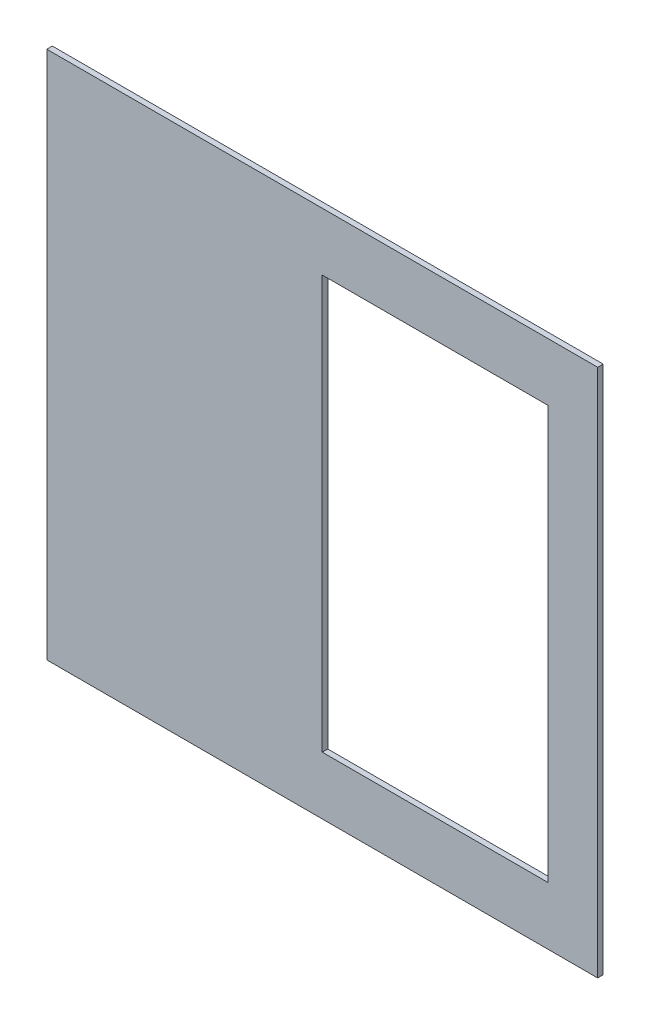
ISO-10303-21;
HEADER;
FILE_DESCRIPTION(('STEP AP214'),'2;1');
FILE_NAME('part.step','',(''),(''),'','','');
FILE_SCHEMA(('AUTOMOTIVE_DESIGN { 1 0 10303 214 1 1 1 1 }'));
ENDSEC;
DATA;
#1=APPLICATION_CONTEXT('core data for automotive mechanical design processes');
#2=APPLICATION_PROTOCOL_DEFINITION('international standard','automotive_design',2000,#1);
#3=PRODUCT_CONTEXT('',#1,'mechanical');
#4=PRODUCT('Part','Part','',(#3));
#5=PRODUCT_RELATED_PRODUCT_CATEGORY('part','',(#4));
#6=PRODUCT_DEFINITION_FORMATION('','',#4);
#7=PRODUCT_DEFINITION_CONTEXT('part definition',#1,'design');
#8=PRODUCT_DEFINITION('design','',#6,#7);
#9=PRODUCT_DEFINITION_SHAPE('','',#8);
#10=(LENGTH_UNIT() NAMED_UNIT(*) SI_UNIT(.MILLI.,.METRE.));
#11=(NAMED_UNIT(*) PLANE_ANGLE_UNIT() SI_UNIT($,.RADIAN.));
#12=(NAMED_UNIT(*) SI_UNIT($,.STERADIAN.) SOLID_ANGLE_UNIT());
#13=UNCERTAINTY_MEASURE_WITH_UNIT(LENGTH_MEASURE(1.E-05),#10,'distance_accuracy_value','');
#14=(GEOMETRIC_REPRESENTATION_CONTEXT(3) GLOBAL_UNCERTAINTY_ASSIGNED_CONTEXT((#13)) GLOBAL_UNIT_ASSIGNED_CONTEXT((#10,
#11,#12)) REPRESENTATION_CONTEXT('',''));
#15=CARTESIAN_POINT('',(0.,0.,0.));
#16=DIRECTION('',(0.,0.,1.));
#17=DIRECTION('',(1.,0.,0.));
#18=AXIS2_PLACEMENT_3D('',#15,#16,#17);
#19=CARTESIAN_POINT('',(-317.5,-304.8,3.175));
#20=DIRECTION('',(-1.,0.,0.));
#21=DIRECTION('',(0.,0.,1.));
#22=AXIS2_PLACEMENT_3D('',#19,#20,#21);
#23=PLANE('',#22);
#24=DIRECTION('',(0.,1.,0.));
#25=VECTOR('',#24,1.);
#26=CARTESIAN_POINT('',(-317.5,-304.8,-3.175));
#27=LINE('',#26,#25);
#28=CARTESIAN_POINT('',(-317.5,-304.8,-3.175));
#29=VERTEX_POINT('',#28);
#30=CARTESIAN_POINT('',(-317.5,304.8,-3.175));
#31=VERTEX_POINT('',#30);
#32=EDGE_CURVE('E148',#29,#31,#27,.T.);
#33=ORIENTED_EDGE('',*,*,#32,.F.);
#34=DIRECTION('',(0.,0.,-1.));
#35=VECTOR('',#34,1.);
#36=CARTESIAN_POINT('',(-317.5,-304.8,3.175));
#37=LINE('',#36,#35);
#38=CARTESIAN_POINT('',(-317.5,-304.8,3.175));
#39=VERTEX_POINT('',#38);
#40=EDGE_CURVE('E11',#39,#29,#37,.T.);
#41=ORIENTED_EDGE('',*,*,#40,.F.);
#42=DIRECTION('',(0.,1.,0.));
#43=VECTOR('',#42,1.);
#44=CARTESIAN_POINT('',(-317.5,-304.8,3.175));
#45=LINE('',#44,#43);
#46=CARTESIAN_POINT('',(-317.5,304.8,3.175));
#47=VERTEX_POINT('',#46);
#48=EDGE_CURVE('E154',#39,#47,#45,.T.);
#49=ORIENTED_EDGE('',*,*,#48,.T.);
#50=DIRECTION('',(0.,0.,-1.));
#51=VECTOR('',#50,1.);
#52=CARTESIAN_POINT('',(-317.5,304.8,3.175));
#53=LINE('',#52,#51);
#54=EDGE_CURVE('E42',#47,#31,#53,.T.);
#55=ORIENTED_EDGE('',*,*,#54,.T.);
#56=EDGE_LOOP('',(#33,#41,#49,#55));
#57=FACE_BOUND('',#56,.T.);
#58=ADVANCED_FACE('F39',(#57),#23,.T.);
#59=CARTESIAN_POINT('',(-317.5,-304.8,3.175));
#60=DIRECTION('',(0.,1.,0.));
#61=DIRECTION('',(0.,0.,1.));
#62=AXIS2_PLACEMENT_3D('',#59,#60,#61);
#63=PLANE('',#62);
#64=DIRECTION('',(1.,0.,0.));
#65=VECTOR('',#64,1.);
#66=CARTESIAN_POINT('',(-317.5,-304.8,-3.175));
#67=LINE('',#66,#65);
#68=CARTESIAN_POINT('',(317.5,-304.8,-3.175));
#69=VERTEX_POINT('',#68);
#70=EDGE_CURVE('E159',#29,#69,#67,.T.);
#71=ORIENTED_EDGE('',*,*,#70,.T.);
#72=DIRECTION('',(0.,0.,-1.));
#73=VECTOR('',#72,1.);
#74=CARTESIAN_POINT('',(317.5,-304.8,3.175));
#75=LINE('',#74,#73);
#76=CARTESIAN_POINT('',(317.5,-304.8,3.175));
#77=VERTEX_POINT('',#76);
#78=EDGE_CURVE('E48',#77,#69,#75,.T.);
#79=ORIENTED_EDGE('',*,*,#78,.F.);
#80=DIRECTION('',(1.,0.,0.));
#81=VECTOR('',#80,1.);
#82=CARTESIAN_POINT('',(-317.5,-304.8,3.175));
#83=LINE('',#82,#81);
#84=EDGE_CURVE('E166',#39,#77,#83,.T.);
#85=ORIENTED_EDGE('',*,*,#84,.F.);
#86=ORIENTED_EDGE('',*,*,#40,.T.);
#87=EDGE_LOOP('',(#71,#79,#85,#86));
#88=FACE_BOUND('',#87,.T.);
#89=ADVANCED_FACE('F199',(#88),#63,.F.);
#90=CARTESIAN_POINT('',(317.5,-304.8,3.175));
#91=DIRECTION('',(-1.,0.,0.));
#92=DIRECTION('',(0.,0.,1.));
#93=AXIS2_PLACEMENT_3D('',#90,#91,#92);
#94=PLANE('',#93);
#95=DIRECTION('',(0.,1.,0.));
#96=VECTOR('',#95,1.);
#97=CARTESIAN_POINT('',(317.5,-304.8,-3.175));
#98=LINE('',#97,#96);
#99=CARTESIAN_POINT('',(317.5,304.8,-3.175));
#100=VERTEX_POINT('',#99);
#101=EDGE_CURVE('E176',#69,#100,#98,.T.);
#102=ORIENTED_EDGE('',*,*,#101,.T.);
#103=DIRECTION('',(0.,0.,-1.));
#104=VECTOR('',#103,1.);
#105=CARTESIAN_POINT('',(317.5,304.8,3.175));
#106=LINE('',#105,#104);
#107=CARTESIAN_POINT('',(317.5,304.8,3.175));
#108=VERTEX_POINT('',#107);
#109=EDGE_CURVE('E184',#108,#100,#106,.T.);
#110=ORIENTED_EDGE('',*,*,#109,.F.);
#111=DIRECTION('',(0.,1.,0.));
#112=VECTOR('',#111,1.);
#113=CARTESIAN_POINT('',(317.5,-304.8,3.175));
#114=LINE('',#113,#112);
#115=EDGE_CURVE('E163',#77,#108,#114,.T.);
#116=ORIENTED_EDGE('',*,*,#115,.F.);
#117=ORIENTED_EDGE('',*,*,#78,.T.);
#118=EDGE_LOOP('',(#102,#110,#116,#117));
#119=FACE_BOUND('',#118,.T.);
#120=ADVANCED_FACE('F203',(#119),#94,.F.);
#121=CARTESIAN_POINT('',(-317.5,304.8,3.175));
#122=DIRECTION('',(0.,1.,0.));
#123=DIRECTION('',(0.,0.,1.));
#124=AXIS2_PLACEMENT_3D('',#121,#122,#123);
#125=PLANE('',#124);
#126=DIRECTION('',(1.,0.,0.));
#127=VECTOR('',#126,1.);
#128=CARTESIAN_POINT('',(-317.5,304.8,-3.175));
#129=LINE('',#128,#127);
#130=EDGE_CURVE('E172',#31,#100,#129,.T.);
#131=ORIENTED_EDGE('',*,*,#130,.F.);
#132=ORIENTED_EDGE('',*,*,#54,.F.);
#133=DIRECTION('',(1.,0.,0.));
#134=VECTOR('',#133,1.);
#135=CARTESIAN_POINT('',(-317.5,304.8,3.175));
#136=LINE('',#135,#134);
#137=EDGE_CURVE('E158',#47,#108,#136,.T.);
#138=ORIENTED_EDGE('',*,*,#137,.T.);
#139=ORIENTED_EDGE('',*,*,#109,.T.);
#140=EDGE_LOOP('',(#131,#132,#138,#139));
#141=FACE_BOUND('',#140,.T.);
#142=ADVANCED_FACE('F194',(#141),#125,.T.);
#143=CARTESIAN_POINT('',(0.,0.,3.175));
#144=DIRECTION('',(0.,0.,-1.));
#145=DIRECTION('',(-1.,0.,0.));
#146=AXIS2_PLACEMENT_3D('',#143,#144,#145);
#147=PLANE('',#146);
#148=DIRECTION('',(-1.,0.,0.));
#149=VECTOR('',#148,1.);
#150=CARTESIAN_POINT('',(0.,238.125,3.175));
#151=LINE('',#150,#149);
#152=CARTESIAN_POINT('',(260.35,238.125,3.175));
#153=VERTEX_POINT('',#152);
#154=CARTESIAN_POINT('',(0.,238.125,3.175));
#155=VERTEX_POINT('',#154);
#156=EDGE_CURVE('E139',#153,#155,#151,.T.);
#157=ORIENTED_EDGE('',*,*,#156,.F.);
#158=DIRECTION('',(0.,1.,0.));
#159=VECTOR('',#158,1.);
#160=CARTESIAN_POINT('',(260.35,-238.125,3.175));
#161=LINE('',#160,#159);
#162=CARTESIAN_POINT('',(260.35,-238.125,3.175));
#163=VERTEX_POINT('',#162);
#164=EDGE_CURVE('E56',#163,#153,#161,.T.);
#165=ORIENTED_EDGE('',*,*,#164,.F.);
#166=DIRECTION('',(1.,0.,0.));
#167=VECTOR('',#166,1.);
#168=CARTESIAN_POINT('',(0.,-238.125,3.175));
#169=LINE('',#168,#167);
#170=CARTESIAN_POINT('',(0.,-238.125,3.175));
#171=VERTEX_POINT('',#170);
#172=EDGE_CURVE('E126',#171,#163,#169,.T.);
#173=ORIENTED_EDGE('',*,*,#172,.F.);
#174=DIRECTION('',(0.,-1.,0.));
#175=VECTOR('',#174,1.);
#176=CARTESIAN_POINT('',(0.,-238.125,3.175));
#177=LINE('',#176,#175);
#178=EDGE_CURVE('E130',#155,#171,#177,.T.);
#179=ORIENTED_EDGE('',*,*,#178,.F.);
#180=EDGE_LOOP('',(#157,#165,#173,#179));
#181=FACE_BOUND('',#180,.T.);
#182=ORIENTED_EDGE('',*,*,#48,.F.);
#183=ORIENTED_EDGE('',*,*,#84,.T.);
#184=ORIENTED_EDGE('',*,*,#115,.T.);
#185=ORIENTED_EDGE('',*,*,#137,.F.);
#186=EDGE_LOOP('',(#182,#183,#184,#185));
#187=FACE_BOUND('',#186,.T.);
#188=ADVANCED_FACE('F205',(#181,#187),#147,.F.);
#189=CARTESIAN_POINT('',(0.,0.,-3.175));
#190=DIRECTION('',(0.,0.,-1.));
#191=DIRECTION('',(-1.,0.,0.));
#192=AXIS2_PLACEMENT_3D('',#189,#190,#191);
#193=PLANE('',#192);
#194=DIRECTION('',(0.,1.,0.));
#195=VECTOR('',#194,1.);
#196=CARTESIAN_POINT('',(260.35,-238.125,-3.175));
#197=LINE('',#196,#195);
#198=CARTESIAN_POINT('',(260.35,-238.125,-3.175));
#199=VERTEX_POINT('',#198);
#200=CARTESIAN_POINT('',(260.35,238.125,-3.175));
#201=VERTEX_POINT('',#200);
#202=EDGE_CURVE('E107',#199,#201,#197,.T.);
#203=ORIENTED_EDGE('',*,*,#202,.T.);
#204=DIRECTION('',(-1.,0.,0.));
#205=VECTOR('',#204,1.);
#206=CARTESIAN_POINT('',(0.,238.125,-3.175));
#207=LINE('',#206,#205);
#208=CARTESIAN_POINT('',(0.,238.125,-3.175));
#209=VERTEX_POINT('',#208);
#210=EDGE_CURVE('E117',#201,#209,#207,.T.);
#211=ORIENTED_EDGE('',*,*,#210,.T.);
#212=DIRECTION('',(0.,-1.,0.));
#213=VECTOR('',#212,1.);
#214=CARTESIAN_POINT('',(0.,-238.125,-3.175));
#215=LINE('',#214,#213);
#216=CARTESIAN_POINT('',(0.,-238.125,-3.175));
#217=VERTEX_POINT('',#216);
#218=EDGE_CURVE('E64',#209,#217,#215,.T.);
#219=ORIENTED_EDGE('',*,*,#218,.T.);
#220=DIRECTION('',(1.,0.,0.));
#221=VECTOR('',#220,1.);
#222=CARTESIAN_POINT('',(0.,-238.125,-3.175));
#223=LINE('',#222,#221);
#224=EDGE_CURVE('E114',#217,#199,#223,.T.);
#225=ORIENTED_EDGE('',*,*,#224,.T.);
#226=EDGE_LOOP('',(#203,#211,#219,#225));
#227=FACE_BOUND('',#226,.T.);
#228=ORIENTED_EDGE('',*,*,#32,.T.);
#229=ORIENTED_EDGE('',*,*,#130,.T.);
#230=ORIENTED_EDGE('',*,*,#101,.F.);
#231=ORIENTED_EDGE('',*,*,#70,.F.);
#232=EDGE_LOOP('',(#228,#229,#230,#231));
#233=FACE_BOUND('',#232,.T.);
#234=ADVANCED_FACE('F122',(#227,#233),#193,.T.);
#235=CARTESIAN_POINT('',(260.35,-238.125,-3.175));
#236=DIRECTION('',(1.,0.,0.));
#237=DIRECTION('',(0.,0.,-1.));
#238=AXIS2_PLACEMENT_3D('',#235,#236,#237);
#239=PLANE('',#238);
#240=ORIENTED_EDGE('',*,*,#164,.T.);
#241=DIRECTION('',(0.,0.,1.));
#242=VECTOR('',#241,1.);
#243=CARTESIAN_POINT('',(260.35,238.125,-3.175));
#244=LINE('',#243,#242);
#245=EDGE_CURVE('E103',#201,#153,#244,.T.);
#246=ORIENTED_EDGE('',*,*,#245,.F.);
#247=ORIENTED_EDGE('',*,*,#202,.F.);
#248=DIRECTION('',(0.,0.,1.));
#249=VECTOR('',#248,1.);
#250=CARTESIAN_POINT('',(260.35,-238.125,-3.175));
#251=LINE('',#250,#249);
#252=EDGE_CURVE('E145',#199,#163,#251,.T.);
#253=ORIENTED_EDGE('',*,*,#252,.T.);
#254=EDGE_LOOP('',(#240,#246,#247,#253));
#255=FACE_BOUND('',#254,.T.);
#256=ADVANCED_FACE('F105',(#255),#239,.F.);
#257=CARTESIAN_POINT('',(0.,-238.125,-3.175));
#258=DIRECTION('',(0.,-1.,0.));
#259=DIRECTION('',(1.,0.,0.));
#260=AXIS2_PLACEMENT_3D('',#257,#258,#259);
#261=PLANE('',#260);
#262=ORIENTED_EDGE('',*,*,#172,.T.);
#263=ORIENTED_EDGE('',*,*,#252,.F.);
#264=ORIENTED_EDGE('',*,*,#224,.F.);
#265=DIRECTION('',(0.,0.,1.));
#266=VECTOR('',#265,1.);
#267=CARTESIAN_POINT('',(0.,-238.125,-3.175));
#268=LINE('',#267,#266);
#269=EDGE_CURVE('E149',#217,#171,#268,.T.);
#270=ORIENTED_EDGE('',*,*,#269,.T.);
#271=EDGE_LOOP('',(#262,#263,#264,#270));
#272=FACE_BOUND('',#271,.T.);
#273=ADVANCED_FACE('F249',(#272),#261,.F.);
#274=CARTESIAN_POINT('',(0.,-238.125,-3.175));
#275=DIRECTION('',(-1.,0.,0.));
#276=DIRECTION('',(0.,-1.,0.));
#277=AXIS2_PLACEMENT_3D('',#274,#275,#276);
#278=PLANE('',#277);
#279=ORIENTED_EDGE('',*,*,#178,.T.);
#280=ORIENTED_EDGE('',*,*,#269,.F.);
#281=ORIENTED_EDGE('',*,*,#218,.F.);
#282=DIRECTION('',(0.,0.,1.));
#283=VECTOR('',#282,1.);
#284=CARTESIAN_POINT('',(0.,238.125,-3.175));
#285=LINE('',#284,#283);
#286=EDGE_CURVE('E113',#209,#155,#285,.T.);
#287=ORIENTED_EDGE('',*,*,#286,.T.);
#288=EDGE_LOOP('',(#279,#280,#281,#287));
#289=FACE_BOUND('',#288,.T.);
#290=ADVANCED_FACE('F257',(#289),#278,.F.);
#291=CARTESIAN_POINT('',(0.,238.125,-3.175));
#292=DIRECTION('',(0.,1.,0.));
#293=DIRECTION('',(-1.,0.,0.));
#294=AXIS2_PLACEMENT_3D('',#291,#292,#293);
#295=PLANE('',#294);
#296=ORIENTED_EDGE('',*,*,#156,.T.);
#297=ORIENTED_EDGE('',*,*,#286,.F.);
#298=ORIENTED_EDGE('',*,*,#210,.F.);
#299=ORIENTED_EDGE('',*,*,#245,.T.);
#300=EDGE_LOOP('',(#296,#297,#298,#299));
#301=FACE_BOUND('',#300,.T.);
#302=ADVANCED_FACE('F118',(#301),#295,.F.);
#303=CLOSED_SHELL('',(#58,#89,#120,#142,#188,#234,#256,#273,#290,#302));
#304=MANIFOLD_SOLID_BREP('B2',#303);
#305=ADVANCED_BREP_SHAPE_REPRESENTATION('',(#18,#304),#14);
#306=SHAPE_DEFINITION_REPRESENTATION(#9,#305);
ENDSEC;
END-ISO-10303-21;
